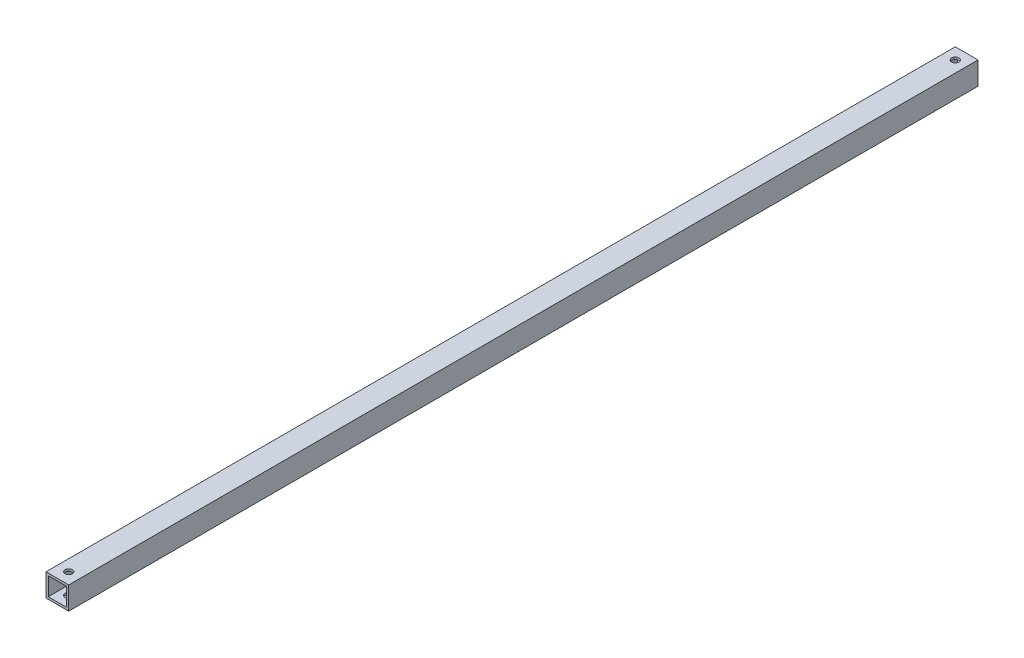
ISO-10303-21;
HEADER;
FILE_DESCRIPTION(('STEP AP214'),'2;1');
FILE_NAME('part.step','',(''),(''),'','','');
FILE_SCHEMA(('AUTOMOTIVE_DESIGN { 1 0 10303 214 1 1 1 1 }'));
ENDSEC;
DATA;
#1=APPLICATION_CONTEXT('core data for automotive mechanical design processes');
#2=APPLICATION_PROTOCOL_DEFINITION('international standard','automotive_design',2000,#1);
#3=PRODUCT_CONTEXT('',#1,'mechanical');
#4=PRODUCT('Part','Part','',(#3));
#5=PRODUCT_RELATED_PRODUCT_CATEGORY('part','',(#4));
#6=PRODUCT_DEFINITION_FORMATION('','',#4);
#7=PRODUCT_DEFINITION_CONTEXT('part definition',#1,'design');
#8=PRODUCT_DEFINITION('design','',#6,#7);
#9=PRODUCT_DEFINITION_SHAPE('','',#8);
#10=(LENGTH_UNIT() NAMED_UNIT(*) SI_UNIT(.MILLI.,.METRE.));
#11=(NAMED_UNIT(*) PLANE_ANGLE_UNIT() SI_UNIT($,.RADIAN.));
#12=(NAMED_UNIT(*) SI_UNIT($,.STERADIAN.) SOLID_ANGLE_UNIT());
#13=UNCERTAINTY_MEASURE_WITH_UNIT(LENGTH_MEASURE(1.E-05),#10,'distance_accuracy_value','');
#14=(GEOMETRIC_REPRESENTATION_CONTEXT(3) GLOBAL_UNCERTAINTY_ASSIGNED_CONTEXT((#13)) GLOBAL_UNIT_ASSIGNED_CONTEXT((#10,
#11,#12)) REPRESENTATION_CONTEXT('',''));
#15=CARTESIAN_POINT('',(0.,0.,0.));
#16=DIRECTION('',(0.,0.,1.));
#17=DIRECTION('',(1.,0.,0.));
#18=AXIS2_PLACEMENT_3D('',#15,#16,#17);
#19=CARTESIAN_POINT('',(0.,0.,399.7114317));
#20=DIRECTION('',(0.,0.,1.));
#21=DIRECTION('',(1.,0.,0.));
#22=AXIS2_PLACEMENT_3D('',#19,#20,#21);
#23=PLANE('',#22);
#24=DIRECTION('',(0.,1.,0.));
#25=VECTOR('',#24,1.);
#26=CARTESIAN_POINT('',(5.,5.,399.7114317));
#27=LINE('',#26,#25);
#28=CARTESIAN_POINT('',(5.,-5.,399.7114317));
#29=VERTEX_POINT('',#28);
#30=CARTESIAN_POINT('',(5.,5.,399.7114317));
#31=VERTEX_POINT('',#30);
#32=EDGE_CURVE('E138',#29,#31,#27,.T.);
#33=ORIENTED_EDGE('',*,*,#32,.T.);
#34=DIRECTION('',(-1.,0.,0.));
#35=VECTOR('',#34,1.);
#36=CARTESIAN_POINT('',(-5.,5.,399.7114317));
#37=LINE('',#36,#35);
#38=CARTESIAN_POINT('',(-5.,5.,399.7114317));
#39=VERTEX_POINT('',#38);
#40=EDGE_CURVE('E141',#31,#39,#37,.T.);
#41=ORIENTED_EDGE('',*,*,#40,.T.);
#42=DIRECTION('',(0.,-1.,0.));
#43=VECTOR('',#42,1.);
#44=CARTESIAN_POINT('',(-5.,5.,399.7114317));
#45=LINE('',#44,#43);
#46=CARTESIAN_POINT('',(-5.,-5.,399.7114317));
#47=VERTEX_POINT('',#46);
#48=EDGE_CURVE('E144',#39,#47,#45,.T.);
#49=ORIENTED_EDGE('',*,*,#48,.T.);
#50=DIRECTION('',(1.,0.,0.));
#51=VECTOR('',#50,1.);
#52=CARTESIAN_POINT('',(-5.,-5.,399.7114317));
#53=LINE('',#52,#51);
#54=EDGE_CURVE('E146',#47,#29,#53,.T.);
#55=ORIENTED_EDGE('',*,*,#54,.T.);
#56=EDGE_LOOP('',(#33,#41,#49,#55));
#57=FACE_BOUND('',#56,.T.);
#58=DIRECTION('',(0.,-1.,0.));
#59=VECTOR('',#58,1.);
#60=CARTESIAN_POINT('',(-4.,4.,399.7114317));
#61=LINE('',#60,#59);
#62=CARTESIAN_POINT('',(-4.,4.,399.7114317));
#63=VERTEX_POINT('',#62);
#64=CARTESIAN_POINT('',(-4.,-4.,399.7114317));
#65=VERTEX_POINT('',#64);
#66=EDGE_CURVE('E108',#63,#65,#61,.T.);
#67=ORIENTED_EDGE('',*,*,#66,.F.);
#68=DIRECTION('',(-1.,0.,0.));
#69=VECTOR('',#68,1.);
#70=CARTESIAN_POINT('',(-4.,4.,399.7114317));
#71=LINE('',#70,#69);
#72=CARTESIAN_POINT('',(4.,4.,399.7114317));
#73=VERTEX_POINT('',#72);
#74=EDGE_CURVE('E100',#73,#63,#71,.T.);
#75=ORIENTED_EDGE('',*,*,#74,.F.);
#76=DIRECTION('',(0.,1.,0.));
#77=VECTOR('',#76,1.);
#78=CARTESIAN_POINT('',(4.,4.,399.7114317));
#79=LINE('',#78,#77);
#80=CARTESIAN_POINT('',(4.,-4.,399.7114317));
#81=VERTEX_POINT('',#80);
#82=EDGE_CURVE('E122',#81,#73,#79,.T.);
#83=ORIENTED_EDGE('',*,*,#82,.F.);
#84=DIRECTION('',(1.,0.,0.));
#85=VECTOR('',#84,1.);
#86=CARTESIAN_POINT('',(-4.,-4.,399.7114317));
#87=LINE('',#86,#85);
#88=EDGE_CURVE('E120',#65,#81,#87,.T.);
#89=ORIENTED_EDGE('',*,*,#88,.F.);
#90=EDGE_LOOP('',(#67,#75,#83,#89));
#91=FACE_BOUND('',#90,.T.);
#92=ADVANCED_FACE('F33',(#57,#91),#23,.T.);
#93=CARTESIAN_POINT('',(0.,0.,0.));
#94=DIRECTION('',(0.,0.,1.));
#95=DIRECTION('',(1.,0.,0.));
#96=AXIS2_PLACEMENT_3D('',#93,#94,#95);
#97=PLANE('',#96);
#98=DIRECTION('',(0.,1.,0.));
#99=VECTOR('',#98,1.);
#100=CARTESIAN_POINT('',(5.,5.,0.));
#101=LINE('',#100,#99);
#102=CARTESIAN_POINT('',(5.,-5.,0.));
#103=VERTEX_POINT('',#102);
#104=CARTESIAN_POINT('',(5.,5.,0.));
#105=VERTEX_POINT('',#104);
#106=EDGE_CURVE('E116',#103,#105,#101,.T.);
#107=ORIENTED_EDGE('',*,*,#106,.F.);
#108=DIRECTION('',(1.,0.,0.));
#109=VECTOR('',#108,1.);
#110=CARTESIAN_POINT('',(-5.,-5.,0.));
#111=LINE('',#110,#109);
#112=CARTESIAN_POINT('',(-5.,-5.,0.));
#113=VERTEX_POINT('',#112);
#114=EDGE_CURVE('E142',#113,#103,#111,.T.);
#115=ORIENTED_EDGE('',*,*,#114,.F.);
#116=DIRECTION('',(0.,-1.,0.));
#117=VECTOR('',#116,1.);
#118=CARTESIAN_POINT('',(-5.,5.,0.));
#119=LINE('',#118,#117);
#120=CARTESIAN_POINT('',(-5.,5.,0.));
#121=VERTEX_POINT('',#120);
#122=EDGE_CURVE('E153',#121,#113,#119,.T.);
#123=ORIENTED_EDGE('',*,*,#122,.F.);
#124=DIRECTION('',(-1.,0.,0.));
#125=VECTOR('',#124,1.);
#126=CARTESIAN_POINT('',(-5.,5.,0.));
#127=LINE('',#126,#125);
#128=EDGE_CURVE('E151',#105,#121,#127,.T.);
#129=ORIENTED_EDGE('',*,*,#128,.F.);
#130=EDGE_LOOP('',(#107,#115,#123,#129));
#131=FACE_BOUND('',#130,.T.);
#132=DIRECTION('',(-1.,0.,0.));
#133=VECTOR('',#132,1.);
#134=CARTESIAN_POINT('',(-4.,4.,0.));
#135=LINE('',#134,#133);
#136=CARTESIAN_POINT('',(4.,4.,0.));
#137=VERTEX_POINT('',#136);
#138=CARTESIAN_POINT('',(-4.,4.,0.));
#139=VERTEX_POINT('',#138);
#140=EDGE_CURVE('E58',#137,#139,#135,.T.);
#141=ORIENTED_EDGE('',*,*,#140,.T.);
#142=DIRECTION('',(0.,-1.,0.));
#143=VECTOR('',#142,1.);
#144=CARTESIAN_POINT('',(-4.,4.,0.));
#145=LINE('',#144,#143);
#146=CARTESIAN_POINT('',(-4.,-4.,0.));
#147=VERTEX_POINT('',#146);
#148=EDGE_CURVE('E115',#139,#147,#145,.T.);
#149=ORIENTED_EDGE('',*,*,#148,.T.);
#150=DIRECTION('',(1.,0.,0.));
#151=VECTOR('',#150,1.);
#152=CARTESIAN_POINT('',(-4.,-4.,0.));
#153=LINE('',#152,#151);
#154=CARTESIAN_POINT('',(4.,-4.,0.));
#155=VERTEX_POINT('',#154);
#156=EDGE_CURVE('E130',#147,#155,#153,.T.);
#157=ORIENTED_EDGE('',*,*,#156,.T.);
#158=DIRECTION('',(0.,1.,0.));
#159=VECTOR('',#158,1.);
#160=CARTESIAN_POINT('',(4.,4.,0.));
#161=LINE('',#160,#159);
#162=EDGE_CURVE('E109',#155,#137,#161,.T.);
#163=ORIENTED_EDGE('',*,*,#162,.T.);
#164=EDGE_LOOP('',(#141,#149,#157,#163));
#165=FACE_BOUND('',#164,.T.);
#166=ADVANCED_FACE('F200',(#131,#165),#97,.F.);
#167=CARTESIAN_POINT('',(5.,5.,399.7114317));
#168=DIRECTION('',(-1.,0.,0.));
#169=DIRECTION('',(0.,-1.,0.));
#170=AXIS2_PLACEMENT_3D('',#167,#168,#169);
#171=PLANE('',#170);
#172=ORIENTED_EDGE('',*,*,#106,.T.);
#173=DIRECTION('',(0.,0.,-1.));
#174=VECTOR('',#173,1.);
#175=CARTESIAN_POINT('',(5.,5.,399.7114317));
#176=LINE('',#175,#174);
#177=EDGE_CURVE('E11',#31,#105,#176,.T.);
#178=ORIENTED_EDGE('',*,*,#177,.F.);
#179=ORIENTED_EDGE('',*,*,#32,.F.);
#180=DIRECTION('',(0.,0.,-1.));
#181=VECTOR('',#180,1.);
#182=CARTESIAN_POINT('',(5.,-5.,399.7114317));
#183=LINE('',#182,#181);
#184=EDGE_CURVE('E148',#29,#103,#183,.T.);
#185=ORIENTED_EDGE('',*,*,#184,.T.);
#186=EDGE_LOOP('',(#172,#178,#179,#185));
#187=FACE_BOUND('',#186,.T.);
#188=ADVANCED_FACE('F35',(#187),#171,.F.);
#189=CARTESIAN_POINT('',(-5.,5.,399.7114317));
#190=DIRECTION('',(0.,-1.,0.));
#191=DIRECTION('',(0.,0.,-1.));
#192=AXIS2_PLACEMENT_3D('',#189,#190,#191);
#193=PLANE('',#192);
#194=CARTESIAN_POINT('',(0.,5.,394.7114317));
#195=DIRECTION('',(0.,1.,0.));
#196=DIRECTION('',(0.,0.,1.));
#197=AXIS2_PLACEMENT_3D('',#194,#195,#196);
#198=CIRCLE('',#197,1.59999999999999);
#199=CARTESIAN_POINT('',(0.,5.,396.3114317));
#200=VERTEX_POINT('',#199);
#201=EDGE_CURVE('E227',#200,#200,#198,.T.);
#202=ORIENTED_EDGE('',*,*,#201,.F.);
#203=EDGE_LOOP('',(#202));
#204=FACE_BOUND('',#203,.T.);
#205=CARTESIAN_POINT('',(0.,5.,5.));
#206=DIRECTION('',(0.,1.,0.));
#207=DIRECTION('',(0.,0.,1.));
#208=AXIS2_PLACEMENT_3D('',#205,#206,#207);
#209=CIRCLE('',#208,1.6);
#210=CARTESIAN_POINT('',(0.,5.,6.6));
#211=VERTEX_POINT('',#210);
#212=EDGE_CURVE('E165',#211,#211,#209,.T.);
#213=ORIENTED_EDGE('',*,*,#212,.F.);
#214=EDGE_LOOP('',(#213));
#215=FACE_BOUND('',#214,.T.);
#216=ORIENTED_EDGE('',*,*,#128,.T.);
#217=DIRECTION('',(0.,0.,-1.));
#218=VECTOR('',#217,1.);
#219=CARTESIAN_POINT('',(-5.,5.,399.7114317));
#220=LINE('',#219,#218);
#221=EDGE_CURVE('E42',#39,#121,#220,.T.);
#222=ORIENTED_EDGE('',*,*,#221,.F.);
#223=ORIENTED_EDGE('',*,*,#40,.F.);
#224=ORIENTED_EDGE('',*,*,#177,.T.);
#225=EDGE_LOOP('',(#216,#222,#223,#224));
#226=FACE_BOUND('',#225,.T.);
#227=ADVANCED_FACE('F216',(#204,#215,#226),#193,.F.);
#228=CARTESIAN_POINT('',(-5.,5.,399.7114317));
#229=DIRECTION('',(1.,0.,0.));
#230=DIRECTION('',(0.,1.,0.));
#231=AXIS2_PLACEMENT_3D('',#228,#229,#230);
#232=PLANE('',#231);
#233=ORIENTED_EDGE('',*,*,#122,.T.);
#234=DIRECTION('',(0.,0.,-1.));
#235=VECTOR('',#234,1.);
#236=CARTESIAN_POINT('',(-5.,-5.,399.7114317));
#237=LINE('',#236,#235);
#238=EDGE_CURVE('E158',#47,#113,#237,.T.);
#239=ORIENTED_EDGE('',*,*,#238,.F.);
#240=ORIENTED_EDGE('',*,*,#48,.F.);
#241=ORIENTED_EDGE('',*,*,#221,.T.);
#242=EDGE_LOOP('',(#233,#239,#240,#241));
#243=FACE_BOUND('',#242,.T.);
#244=ADVANCED_FACE('F213',(#243),#232,.F.);
#245=CARTESIAN_POINT('',(-5.,-5.,399.7114317));
#246=DIRECTION('',(0.,1.,0.));
#247=DIRECTION('',(0.,0.,1.));
#248=AXIS2_PLACEMENT_3D('',#245,#246,#247);
#249=PLANE('',#248);
#250=CARTESIAN_POINT('',(0.,-5.,394.7114317));
#251=DIRECTION('',(0.,1.,0.));
#252=DIRECTION('',(0.,0.,1.));
#253=AXIS2_PLACEMENT_3D('',#250,#251,#252);
#254=CIRCLE('',#253,1.59999999999999);
#255=CARTESIAN_POINT('',(0.,-5.,396.3114317));
#256=VERTEX_POINT('',#255);
#257=EDGE_CURVE('E171',#256,#256,#254,.T.);
#258=ORIENTED_EDGE('',*,*,#257,.T.);
#259=EDGE_LOOP('',(#258));
#260=FACE_BOUND('',#259,.T.);
#261=CARTESIAN_POINT('',(0.,-5.,5.));
#262=DIRECTION('',(0.,1.,0.));
#263=DIRECTION('',(0.,0.,1.));
#264=AXIS2_PLACEMENT_3D('',#261,#262,#263);
#265=CIRCLE('',#264,1.6);
#266=CARTESIAN_POINT('',(0.,-5.,6.6));
#267=VERTEX_POINT('',#266);
#268=EDGE_CURVE('E128',#267,#267,#265,.T.);
#269=ORIENTED_EDGE('',*,*,#268,.T.);
#270=EDGE_LOOP('',(#269));
#271=FACE_BOUND('',#270,.T.);
#272=ORIENTED_EDGE('',*,*,#114,.T.);
#273=ORIENTED_EDGE('',*,*,#184,.F.);
#274=ORIENTED_EDGE('',*,*,#54,.F.);
#275=ORIENTED_EDGE('',*,*,#238,.T.);
#276=EDGE_LOOP('',(#272,#273,#274,#275));
#277=FACE_BOUND('',#276,.T.);
#278=ADVANCED_FACE('F182',(#260,#271,#277),#249,.F.);
#279=CARTESIAN_POINT('',(-4.,4.,399.7114317));
#280=DIRECTION('',(0.,-1.,0.));
#281=DIRECTION('',(0.,0.,-1.));
#282=AXIS2_PLACEMENT_3D('',#279,#280,#281);
#283=PLANE('',#282);
#284=CARTESIAN_POINT('',(0.,4.,394.7114317));
#285=DIRECTION('',(0.,-1.,0.));
#286=DIRECTION('',(0.,0.,-1.));
#287=AXIS2_PLACEMENT_3D('',#284,#285,#286);
#288=CIRCLE('',#287,1.59999999999999);
#289=CARTESIAN_POINT('',(0.,4.,393.1114317));
#290=VERTEX_POINT('',#289);
#291=EDGE_CURVE('E176',#290,#290,#288,.T.);
#292=ORIENTED_EDGE('',*,*,#291,.F.);
#293=EDGE_LOOP('',(#292));
#294=FACE_BOUND('',#293,.T.);
#295=CARTESIAN_POINT('',(0.,4.,5.));
#296=DIRECTION('',(0.,-1.,0.));
#297=DIRECTION('',(0.,0.,-1.));
#298=AXIS2_PLACEMENT_3D('',#295,#296,#297);
#299=CIRCLE('',#298,1.6);
#300=CARTESIAN_POINT('',(0.,4.,3.4));
#301=VERTEX_POINT('',#300);
#302=EDGE_CURVE('E164',#301,#301,#299,.T.);
#303=ORIENTED_EDGE('',*,*,#302,.F.);
#304=EDGE_LOOP('',(#303));
#305=FACE_BOUND('',#304,.T.);
#306=ORIENTED_EDGE('',*,*,#140,.F.);
#307=DIRECTION('',(0.,0.,-1.));
#308=VECTOR('',#307,1.);
#309=CARTESIAN_POINT('',(4.,4.,399.7114317));
#310=LINE('',#309,#308);
#311=EDGE_CURVE('E104',#73,#137,#310,.T.);
#312=ORIENTED_EDGE('',*,*,#311,.F.);
#313=ORIENTED_EDGE('',*,*,#74,.T.);
#314=DIRECTION('',(0.,0.,-1.));
#315=VECTOR('',#314,1.);
#316=CARTESIAN_POINT('',(-4.,4.,399.7114317));
#317=LINE('',#316,#315);
#318=EDGE_CURVE('E103',#63,#139,#317,.T.);
#319=ORIENTED_EDGE('',*,*,#318,.T.);
#320=EDGE_LOOP('',(#306,#312,#313,#319));
#321=FACE_BOUND('',#320,.T.);
#322=ADVANCED_FACE('F102',(#294,#305,#321),#283,.T.);
#323=CARTESIAN_POINT('',(-4.,4.,399.7114317));
#324=DIRECTION('',(1.,0.,0.));
#325=DIRECTION('',(0.,1.,0.));
#326=AXIS2_PLACEMENT_3D('',#323,#324,#325);
#327=PLANE('',#326);
#328=ORIENTED_EDGE('',*,*,#148,.F.);
#329=ORIENTED_EDGE('',*,*,#318,.F.);
#330=ORIENTED_EDGE('',*,*,#66,.T.);
#331=DIRECTION('',(0.,0.,-1.));
#332=VECTOR('',#331,1.);
#333=CARTESIAN_POINT('',(-4.,-4.,399.7114317));
#334=LINE('',#333,#332);
#335=EDGE_CURVE('E117',#65,#147,#334,.T.);
#336=ORIENTED_EDGE('',*,*,#335,.T.);
#337=EDGE_LOOP('',(#328,#329,#330,#336));
#338=FACE_BOUND('',#337,.T.);
#339=ADVANCED_FACE('F112',(#338),#327,.T.);
#340=CARTESIAN_POINT('',(-4.,-4.,399.7114317));
#341=DIRECTION('',(0.,1.,0.));
#342=DIRECTION('',(-1.,0.,0.));
#343=AXIS2_PLACEMENT_3D('',#340,#341,#342);
#344=PLANE('',#343);
#345=CARTESIAN_POINT('',(0.,-4.,394.7114317));
#346=DIRECTION('',(0.,1.,0.));
#347=DIRECTION('',(-1.,0.,0.));
#348=AXIS2_PLACEMENT_3D('',#345,#346,#347);
#349=CIRCLE('',#348,1.59999999999999);
#350=CARTESIAN_POINT('',(-1.59999999999999,-4.,394.7114317));
#351=VERTEX_POINT('',#350);
#352=EDGE_CURVE('E37',#351,#351,#349,.T.);
#353=ORIENTED_EDGE('',*,*,#352,.F.);
#354=EDGE_LOOP('',(#353));
#355=FACE_BOUND('',#354,.T.);
#356=CARTESIAN_POINT('',(0.,-4.,5.));
#357=DIRECTION('',(0.,1.,0.));
#358=DIRECTION('',(-1.,0.,0.));
#359=AXIS2_PLACEMENT_3D('',#356,#357,#358);
#360=CIRCLE('',#359,1.6);
#361=CARTESIAN_POINT('',(-1.6,-4.,5.));
#362=VERTEX_POINT('',#361);
#363=EDGE_CURVE('E162',#362,#362,#360,.T.);
#364=ORIENTED_EDGE('',*,*,#363,.F.);
#365=EDGE_LOOP('',(#364));
#366=FACE_BOUND('',#365,.T.);
#367=ORIENTED_EDGE('',*,*,#156,.F.);
#368=ORIENTED_EDGE('',*,*,#335,.F.);
#369=ORIENTED_EDGE('',*,*,#88,.T.);
#370=DIRECTION('',(0.,0.,-1.));
#371=VECTOR('',#370,1.);
#372=CARTESIAN_POINT('',(4.,-4.,399.7114317));
#373=LINE('',#372,#371);
#374=EDGE_CURVE('E50',#81,#155,#373,.T.);
#375=ORIENTED_EDGE('',*,*,#374,.T.);
#376=EDGE_LOOP('',(#367,#368,#369,#375));
#377=FACE_BOUND('',#376,.T.);
#378=ADVANCED_FACE('F196',(#355,#366,#377),#344,.T.);
#379=CARTESIAN_POINT('',(4.,4.,399.7114317));
#380=DIRECTION('',(-1.,0.,0.));
#381=DIRECTION('',(0.,-1.,0.));
#382=AXIS2_PLACEMENT_3D('',#379,#380,#381);
#383=PLANE('',#382);
#384=ORIENTED_EDGE('',*,*,#162,.F.);
#385=ORIENTED_EDGE('',*,*,#374,.F.);
#386=ORIENTED_EDGE('',*,*,#82,.T.);
#387=ORIENTED_EDGE('',*,*,#311,.T.);
#388=EDGE_LOOP('',(#384,#385,#386,#387));
#389=FACE_BOUND('',#388,.T.);
#390=ADVANCED_FACE('F188',(#389),#383,.T.);
#391=CARTESIAN_POINT('',(0.,-403.37168574,5.));
#392=DIRECTION('',(0.,1.,0.));
#393=DIRECTION('',(0.,0.,1.));
#394=AXIS2_PLACEMENT_3D('',#391,#392,#393);
#395=CYLINDRICAL_SURFACE('',#394,1.6);
#396=ORIENTED_EDGE('',*,*,#363,.T.);
#397=EDGE_LOOP('',(#396));
#398=FACE_BOUND('',#397,.T.);
#399=ORIENTED_EDGE('',*,*,#268,.F.);
#400=EDGE_LOOP('',(#399));
#401=FACE_BOUND('',#400,.T.);
#402=ADVANCED_FACE('F185',(#398,#401),#395,.F.);
#403=ORIENTED_EDGE('',*,*,#302,.T.);
#404=EDGE_LOOP('',(#403));
#405=FACE_BOUND('',#404,.T.);
#406=ORIENTED_EDGE('',*,*,#212,.T.);
#407=EDGE_LOOP('',(#406));
#408=FACE_BOUND('',#407,.T.);
#409=ADVANCED_FACE('F187',(#405,#408),#395,.F.);
#410=CARTESIAN_POINT('',(0.,-403.37168574,394.7114317));
#411=DIRECTION('',(0.,1.,0.));
#412=DIRECTION('',(0.,0.,1.));
#413=AXIS2_PLACEMENT_3D('',#410,#411,#412);
#414=CYLINDRICAL_SURFACE('',#413,1.59999999999999);
#415=ORIENTED_EDGE('',*,*,#352,.T.);
#416=EDGE_LOOP('',(#415));
#417=FACE_BOUND('',#416,.T.);
#418=ORIENTED_EDGE('',*,*,#257,.F.);
#419=EDGE_LOOP('',(#418));
#420=FACE_BOUND('',#419,.T.);
#421=ADVANCED_FACE('F194',(#417,#420),#414,.F.);
#422=ORIENTED_EDGE('',*,*,#291,.T.);
#423=EDGE_LOOP('',(#422));
#424=FACE_BOUND('',#423,.T.);
#425=ORIENTED_EDGE('',*,*,#201,.T.);
#426=EDGE_LOOP('',(#425));
#427=FACE_BOUND('',#426,.T.);
#428=ADVANCED_FACE('F255',(#424,#427),#414,.F.);
#429=CLOSED_SHELL('',(#92,#166,#188,#227,#244,#278,#322,#339,#378,#390,#402,#409,#421,#428));
#430=MANIFOLD_SOLID_BREP('B2',#429);
#431=ADVANCED_BREP_SHAPE_REPRESENTATION('',(#18,#430),#14);
#432=SHAPE_DEFINITION_REPRESENTATION(#9,#431);
ENDSEC;
END-ISO-10303-21;
